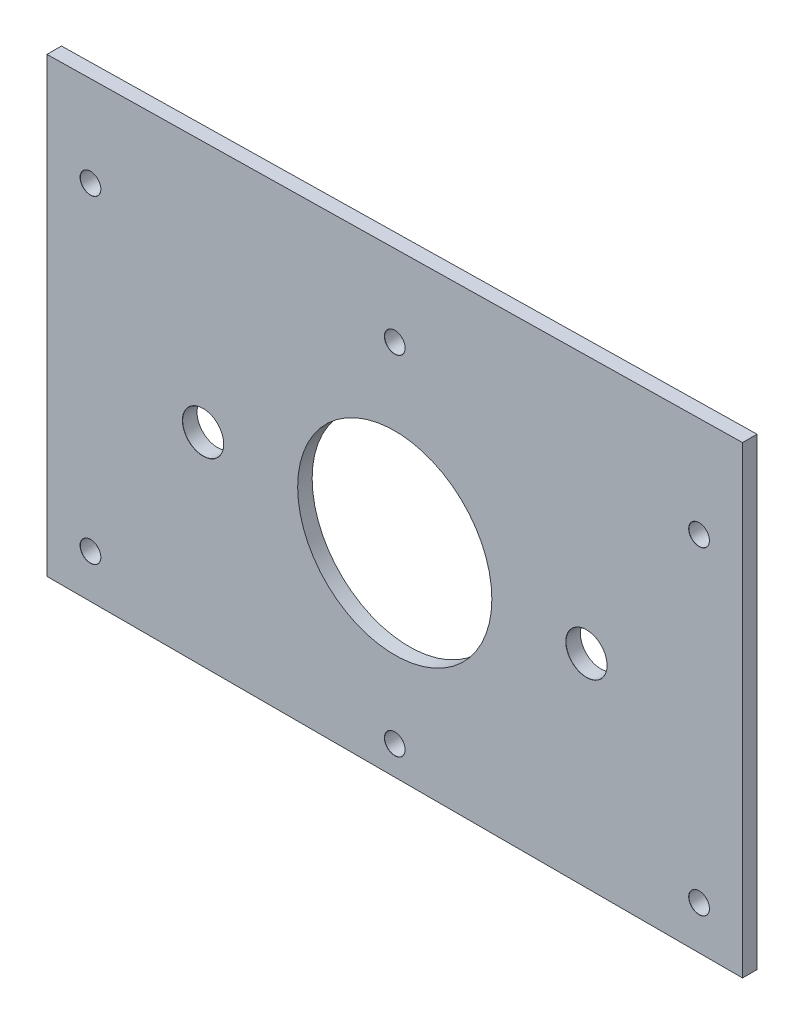
ISO-10303-21;
HEADER;
FILE_DESCRIPTION(('STEP AP214'),'2;1');
FILE_NAME('part.step','',(''),(''),'','','');
FILE_SCHEMA(('AUTOMOTIVE_DESIGN { 1 0 10303 214 1 1 1 1 }'));
ENDSEC;
DATA;
#1=APPLICATION_CONTEXT('core data for automotive mechanical design processes');
#2=APPLICATION_PROTOCOL_DEFINITION('international standard','automotive_design',2000,#1);
#3=PRODUCT_CONTEXT('',#1,'mechanical');
#4=PRODUCT('Part','Part','',(#3));
#5=PRODUCT_RELATED_PRODUCT_CATEGORY('part','',(#4));
#6=PRODUCT_DEFINITION_FORMATION('','',#4);
#7=PRODUCT_DEFINITION_CONTEXT('part definition',#1,'design');
#8=PRODUCT_DEFINITION('design','',#6,#7);
#9=PRODUCT_DEFINITION_SHAPE('','',#8);
#10=(LENGTH_UNIT() NAMED_UNIT(*) SI_UNIT(.MILLI.,.METRE.));
#11=(NAMED_UNIT(*) PLANE_ANGLE_UNIT() SI_UNIT($,.RADIAN.));
#12=(NAMED_UNIT(*) SI_UNIT($,.STERADIAN.) SOLID_ANGLE_UNIT());
#13=UNCERTAINTY_MEASURE_WITH_UNIT(LENGTH_MEASURE(1.E-05),#10,'distance_accuracy_value','');
#14=(GEOMETRIC_REPRESENTATION_CONTEXT(3) GLOBAL_UNCERTAINTY_ASSIGNED_CONTEXT((#13)) GLOBAL_UNIT_ASSIGNED_CONTEXT((#10,
#11,#12)) REPRESENTATION_CONTEXT('',''));
#15=CARTESIAN_POINT('',(0.,0.,0.));
#16=DIRECTION('',(0.,0.,1.));
#17=DIRECTION('',(1.,0.,0.));
#18=AXIS2_PLACEMENT_3D('',#15,#16,#17);
#19=CARTESIAN_POINT('',(76.2,44.45,3.175));
#20=DIRECTION('',(-1.,0.,0.));
#21=DIRECTION('',(0.,0.,1.));
#22=AXIS2_PLACEMENT_3D('',#19,#20,#21);
#23=PLANE('',#22);
#24=DIRECTION('',(0.,1.,0.));
#25=VECTOR('',#24,1.);
#26=CARTESIAN_POINT('',(76.2,44.45,0.));
#27=LINE('',#26,#25);
#28=CARTESIAN_POINT('',(76.2,-44.45,0.));
#29=VERTEX_POINT('',#28);
#30=CARTESIAN_POINT('',(76.2,57.15,0.));
#31=VERTEX_POINT('',#30);
#32=EDGE_CURVE('E74',#29,#31,#27,.T.);
#33=ORIENTED_EDGE('',*,*,#32,.T.);
#34=DIRECTION('',(0.,0.,-1.));
#35=VECTOR('',#34,1.);
#36=CARTESIAN_POINT('',(76.2,57.15,3.175));
#37=LINE('',#36,#35);
#38=CARTESIAN_POINT('',(76.2,57.15,3.175));
#39=VERTEX_POINT('',#38);
#40=EDGE_CURVE('E11',#39,#31,#37,.T.);
#41=ORIENTED_EDGE('',*,*,#40,.F.);
#42=DIRECTION('',(0.,1.,0.));
#43=VECTOR('',#42,1.);
#44=CARTESIAN_POINT('',(76.2,44.45,3.175));
#45=LINE('',#44,#43);
#46=CARTESIAN_POINT('',(76.2,-44.45,3.175));
#47=VERTEX_POINT('',#46);
#48=EDGE_CURVE('E79',#47,#39,#45,.T.);
#49=ORIENTED_EDGE('',*,*,#48,.F.);
#50=DIRECTION('',(0.,0.,-1.));
#51=VECTOR('',#50,1.);
#52=CARTESIAN_POINT('',(76.2,-44.45,3.175));
#53=LINE('',#52,#51);
#54=EDGE_CURVE('E95',#47,#29,#53,.T.);
#55=ORIENTED_EDGE('',*,*,#54,.T.);
#56=EDGE_LOOP('',(#33,#41,#49,#55));
#57=FACE_BOUND('',#56,.T.);
#58=ADVANCED_FACE('F35',(#57),#23,.F.);
#59=CARTESIAN_POINT('',(-76.2,54.61,3.175));
#60=DIRECTION('',(0.0166643523339933,-0.9998611400396,0.));
#61=DIRECTION('',(0.9998611400396,0.0166643523339933,0.));
#62=AXIS2_PLACEMENT_3D('',#59,#60,#61);
#63=PLANE('',#62);
#64=DIRECTION('',(-0.9998611400396,-0.0166643523339933,0.));
#65=VECTOR('',#64,1.);
#66=CARTESIAN_POINT('',(-76.2,54.61,0.));
#67=LINE('',#66,#65);
#68=CARTESIAN_POINT('',(-76.2,54.61,0.));
#69=VERTEX_POINT('',#68);
#70=EDGE_CURVE('E91',#31,#69,#67,.T.);
#71=ORIENTED_EDGE('',*,*,#70,.T.);
#72=DIRECTION('',(0.,0.,-1.));
#73=VECTOR('',#72,1.);
#74=CARTESIAN_POINT('',(-76.2,54.61,3.175));
#75=LINE('',#74,#73);
#76=CARTESIAN_POINT('',(-76.2,54.61,3.175));
#77=VERTEX_POINT('',#76);
#78=EDGE_CURVE('E43',#77,#69,#75,.T.);
#79=ORIENTED_EDGE('',*,*,#78,.F.);
#80=DIRECTION('',(-0.9998611400396,-0.0166643523339933,0.));
#81=VECTOR('',#80,1.);
#82=CARTESIAN_POINT('',(-76.2,54.61,3.175));
#83=LINE('',#82,#81);
#84=EDGE_CURVE('E82',#39,#77,#83,.T.);
#85=ORIENTED_EDGE('',*,*,#84,.F.);
#86=ORIENTED_EDGE('',*,*,#40,.T.);
#87=EDGE_LOOP('',(#71,#79,#85,#86));
#88=FACE_BOUND('',#87,.T.);
#89=ADVANCED_FACE('F90',(#88),#63,.F.);
#90=CARTESIAN_POINT('',(-76.2,44.45,3.175));
#91=DIRECTION('',(1.,0.,0.));
#92=DIRECTION('',(0.,0.,-1.));
#93=AXIS2_PLACEMENT_3D('',#90,#91,#92);
#94=PLANE('',#93);
#95=DIRECTION('',(0.,-1.,0.));
#96=VECTOR('',#95,1.);
#97=CARTESIAN_POINT('',(-76.2,44.45,0.));
#98=LINE('',#97,#96);
#99=CARTESIAN_POINT('',(-76.2,-44.45,0.));
#100=VERTEX_POINT('',#99);
#101=EDGE_CURVE('E67',#69,#100,#98,.T.);
#102=ORIENTED_EDGE('',*,*,#101,.T.);
#103=DIRECTION('',(0.,0.,-1.));
#104=VECTOR('',#103,1.);
#105=CARTESIAN_POINT('',(-76.2,-44.45,3.175));
#106=LINE('',#105,#104);
#107=CARTESIAN_POINT('',(-76.2,-44.45,3.175));
#108=VERTEX_POINT('',#107);
#109=EDGE_CURVE('E92',#108,#100,#106,.T.);
#110=ORIENTED_EDGE('',*,*,#109,.F.);
#111=DIRECTION('',(0.,-1.,0.));
#112=VECTOR('',#111,1.);
#113=CARTESIAN_POINT('',(-76.2,54.61,3.175));
#114=LINE('',#113,#112);
#115=EDGE_CURVE('E86',#77,#108,#114,.T.);
#116=ORIENTED_EDGE('',*,*,#115,.F.);
#117=ORIENTED_EDGE('',*,*,#78,.T.);
#118=EDGE_LOOP('',(#102,#110,#116,#117));
#119=FACE_BOUND('',#118,.T.);
#120=ADVANCED_FACE('F93',(#119),#94,.F.);
#121=CARTESIAN_POINT('',(-76.2,-44.45,3.175));
#122=DIRECTION('',(0.,1.,0.));
#123=DIRECTION('',(0.,0.,1.));
#124=AXIS2_PLACEMENT_3D('',#121,#122,#123);
#125=PLANE('',#124);
#126=DIRECTION('',(1.,0.,0.));
#127=VECTOR('',#126,1.);
#128=CARTESIAN_POINT('',(-76.2,-44.45,0.));
#129=LINE('',#128,#127);
#130=EDGE_CURVE('E103',#100,#29,#129,.T.);
#131=ORIENTED_EDGE('',*,*,#130,.T.);
#132=ORIENTED_EDGE('',*,*,#54,.F.);
#133=DIRECTION('',(1.,0.,0.));
#134=VECTOR('',#133,1.);
#135=CARTESIAN_POINT('',(-76.2,-44.45,3.175));
#136=LINE('',#135,#134);
#137=EDGE_CURVE('E51',#108,#47,#136,.T.);
#138=ORIENTED_EDGE('',*,*,#137,.F.);
#139=ORIENTED_EDGE('',*,*,#109,.T.);
#140=EDGE_LOOP('',(#131,#132,#138,#139));
#141=FACE_BOUND('',#140,.T.);
#142=ADVANCED_FACE('F108',(#141),#125,.F.);
#143=CARTESIAN_POINT('',(0.,0.,3.175));
#144=DIRECTION('',(0.,0.,1.));
#145=DIRECTION('',(1.,0.,0.));
#146=AXIS2_PLACEMENT_3D('',#143,#144,#145);
#147=PLANE('',#146);
#148=CARTESIAN_POINT('',(0.,0.,3.175));
#149=DIRECTION('',(0.,0.,1.));
#150=DIRECTION('',(1.,0.,0.));
#151=AXIS2_PLACEMENT_3D('',#148,#149,#150);
#152=CIRCLE('',#151,21.275);
#153=CARTESIAN_POINT('',(21.275,0.,3.175));
#154=VERTEX_POINT('',#153);
#155=EDGE_CURVE('E204',#154,#154,#152,.T.);
#156=ORIENTED_EDGE('',*,*,#155,.F.);
#157=EDGE_LOOP('',(#156));
#158=FACE_BOUND('',#157,.T.);
#159=CARTESIAN_POINT('',(-42.,0.,3.175));
#160=DIRECTION('',(0.,0.,1.));
#161=DIRECTION('',(1.,0.,0.));
#162=AXIS2_PLACEMENT_3D('',#159,#160,#161);
#163=CIRCLE('',#162,4.525);
#164=CARTESIAN_POINT('',(-37.475,0.,3.175));
#165=VERTEX_POINT('',#164);
#166=EDGE_CURVE('E200',#165,#165,#163,.T.);
#167=ORIENTED_EDGE('',*,*,#166,.F.);
#168=EDGE_LOOP('',(#167));
#169=FACE_BOUND('',#168,.T.);
#170=CARTESIAN_POINT('',(42.,0.,3.175));
#171=DIRECTION('',(0.,0.,1.));
#172=DIRECTION('',(1.,0.,0.));
#173=AXIS2_PLACEMENT_3D('',#170,#171,#172);
#174=CIRCLE('',#173,4.525);
#175=CARTESIAN_POINT('',(46.525,0.,3.175));
#176=VERTEX_POINT('',#175);
#177=EDGE_CURVE('E191',#176,#176,#174,.T.);
#178=ORIENTED_EDGE('',*,*,#177,.F.);
#179=EDGE_LOOP('',(#178));
#180=FACE_BOUND('',#179,.T.);
#181=CARTESIAN_POINT('',(-66.675,34.925,3.175));
#182=DIRECTION('',(0.,0.,1.));
#183=DIRECTION('',(1.,0.,0.));
#184=AXIS2_PLACEMENT_3D('',#181,#182,#183);
#185=CIRCLE('',#184,2.275);
#186=CARTESIAN_POINT('',(-64.4,34.925,3.175));
#187=VERTEX_POINT('',#186);
#188=EDGE_CURVE('E182',#187,#187,#185,.T.);
#189=ORIENTED_EDGE('',*,*,#188,.F.);
#190=EDGE_LOOP('',(#189));
#191=FACE_BOUND('',#190,.T.);
#192=CARTESIAN_POINT('',(-66.675,-34.925,3.175));
#193=DIRECTION('',(0.,0.,1.));
#194=DIRECTION('',(1.,0.,0.));
#195=AXIS2_PLACEMENT_3D('',#192,#193,#194);
#196=CIRCLE('',#195,2.275);
#197=CARTESIAN_POINT('',(-64.4,-34.925,3.175));
#198=VERTEX_POINT('',#197);
#199=EDGE_CURVE('E173',#198,#198,#196,.T.);
#200=ORIENTED_EDGE('',*,*,#199,.F.);
#201=EDGE_LOOP('',(#200));
#202=FACE_BOUND('',#201,.T.);
#203=CARTESIAN_POINT('',(0.,-38.1,3.175));
#204=DIRECTION('',(0.,0.,1.));
#205=DIRECTION('',(1.,0.,0.));
#206=AXIS2_PLACEMENT_3D('',#203,#204,#205);
#207=CIRCLE('',#206,2.275);
#208=CARTESIAN_POINT('',(2.27500000000003,-38.1,3.175));
#209=VERTEX_POINT('',#208);
#210=EDGE_CURVE('E164',#209,#209,#207,.T.);
#211=ORIENTED_EDGE('',*,*,#210,.F.);
#212=EDGE_LOOP('',(#211));
#213=FACE_BOUND('',#212,.T.);
#214=CARTESIAN_POINT('',(66.675,-34.925,3.175));
#215=DIRECTION('',(0.,0.,1.));
#216=DIRECTION('',(1.,0.,0.));
#217=AXIS2_PLACEMENT_3D('',#214,#215,#216);
#218=CIRCLE('',#217,2.275);
#219=CARTESIAN_POINT('',(68.95,-34.925,3.175));
#220=VERTEX_POINT('',#219);
#221=EDGE_CURVE('E155',#220,#220,#218,.T.);
#222=ORIENTED_EDGE('',*,*,#221,.F.);
#223=EDGE_LOOP('',(#222));
#224=FACE_BOUND('',#223,.T.);
#225=CARTESIAN_POINT('',(66.675,34.925,3.175));
#226=DIRECTION('',(0.,0.,1.));
#227=DIRECTION('',(1.,0.,0.));
#228=AXIS2_PLACEMENT_3D('',#225,#226,#227);
#229=CIRCLE('',#228,2.275);
#230=CARTESIAN_POINT('',(68.95,34.925,3.175));
#231=VERTEX_POINT('',#230);
#232=EDGE_CURVE('E146',#231,#231,#229,.T.);
#233=ORIENTED_EDGE('',*,*,#232,.F.);
#234=EDGE_LOOP('',(#233));
#235=FACE_BOUND('',#234,.T.);
#236=CARTESIAN_POINT('',(0.,38.1,3.175));
#237=DIRECTION('',(0.,0.,1.));
#238=DIRECTION('',(1.,0.,0.));
#239=AXIS2_PLACEMENT_3D('',#236,#237,#238);
#240=CIRCLE('',#239,2.275);
#241=CARTESIAN_POINT('',(2.27500000000003,38.1,3.175));
#242=VERTEX_POINT('',#241);
#243=EDGE_CURVE('E137',#242,#242,#240,.T.);
#244=ORIENTED_EDGE('',*,*,#243,.F.);
#245=EDGE_LOOP('',(#244));
#246=FACE_BOUND('',#245,.T.);
#247=ORIENTED_EDGE('',*,*,#48,.T.);
#248=ORIENTED_EDGE('',*,*,#84,.T.);
#249=ORIENTED_EDGE('',*,*,#115,.T.);
#250=ORIENTED_EDGE('',*,*,#137,.T.);
#251=EDGE_LOOP('',(#247,#248,#249,#250));
#252=FACE_BOUND('',#251,.T.);
#253=ADVANCED_FACE('F84',(#158,#169,#180,#191,#202,#213,#224,#235,#246,#252),#147,.T.);
#254=CARTESIAN_POINT('',(0.,0.,0.));
#255=DIRECTION('',(0.,0.,1.));
#256=DIRECTION('',(1.,0.,0.));
#257=AXIS2_PLACEMENT_3D('',#254,#255,#256);
#258=PLANE('',#257);
#259=CARTESIAN_POINT('',(0.,0.,0.));
#260=DIRECTION('',(0.,0.,1.));
#261=DIRECTION('',(1.,0.,0.));
#262=AXIS2_PLACEMENT_3D('',#259,#260,#261);
#263=CIRCLE('',#262,21.275);
#264=CARTESIAN_POINT('',(21.275,0.,0.));
#265=VERTEX_POINT('',#264);
#266=EDGE_CURVE('E203',#265,#265,#263,.T.);
#267=ORIENTED_EDGE('',*,*,#266,.T.);
#268=EDGE_LOOP('',(#267));
#269=FACE_BOUND('',#268,.T.);
#270=CARTESIAN_POINT('',(-42.,0.,0.));
#271=DIRECTION('',(0.,0.,1.));
#272=DIRECTION('',(1.,0.,0.));
#273=AXIS2_PLACEMENT_3D('',#270,#271,#272);
#274=CIRCLE('',#273,4.5);
#275=CARTESIAN_POINT('',(-37.5,0.,0.));
#276=VERTEX_POINT('',#275);
#277=EDGE_CURVE('E194',#276,#276,#274,.T.);
#278=ORIENTED_EDGE('',*,*,#277,.T.);
#279=EDGE_LOOP('',(#278));
#280=FACE_BOUND('',#279,.T.);
#281=CARTESIAN_POINT('',(42.,0.,0.));
#282=DIRECTION('',(0.,0.,1.));
#283=DIRECTION('',(1.,0.,0.));
#284=AXIS2_PLACEMENT_3D('',#281,#282,#283);
#285=CIRCLE('',#284,4.5);
#286=CARTESIAN_POINT('',(46.5,0.,0.));
#287=VERTEX_POINT('',#286);
#288=EDGE_CURVE('E185',#287,#287,#285,.T.);
#289=ORIENTED_EDGE('',*,*,#288,.T.);
#290=EDGE_LOOP('',(#289));
#291=FACE_BOUND('',#290,.T.);
#292=CARTESIAN_POINT('',(-66.675,34.925,0.));
#293=DIRECTION('',(0.,0.,1.));
#294=DIRECTION('',(1.,0.,0.));
#295=AXIS2_PLACEMENT_3D('',#292,#293,#294);
#296=CIRCLE('',#295,2.25);
#297=CARTESIAN_POINT('',(-64.425,34.925,0.));
#298=VERTEX_POINT('',#297);
#299=EDGE_CURVE('E176',#298,#298,#296,.T.);
#300=ORIENTED_EDGE('',*,*,#299,.T.);
#301=EDGE_LOOP('',(#300));
#302=FACE_BOUND('',#301,.T.);
#303=CARTESIAN_POINT('',(-66.675,-34.925,0.));
#304=DIRECTION('',(0.,0.,1.));
#305=DIRECTION('',(1.,0.,0.));
#306=AXIS2_PLACEMENT_3D('',#303,#304,#305);
#307=CIRCLE('',#306,2.25);
#308=CARTESIAN_POINT('',(-64.425,-34.925,0.));
#309=VERTEX_POINT('',#308);
#310=EDGE_CURVE('E167',#309,#309,#307,.T.);
#311=ORIENTED_EDGE('',*,*,#310,.T.);
#312=EDGE_LOOP('',(#311));
#313=FACE_BOUND('',#312,.T.);
#314=CARTESIAN_POINT('',(0.,-38.1,0.));
#315=DIRECTION('',(0.,0.,1.));
#316=DIRECTION('',(1.,0.,0.));
#317=AXIS2_PLACEMENT_3D('',#314,#315,#316);
#318=CIRCLE('',#317,2.25);
#319=CARTESIAN_POINT('',(2.25000000000003,-38.1,0.));
#320=VERTEX_POINT('',#319);
#321=EDGE_CURVE('E158',#320,#320,#318,.T.);
#322=ORIENTED_EDGE('',*,*,#321,.T.);
#323=EDGE_LOOP('',(#322));
#324=FACE_BOUND('',#323,.T.);
#325=CARTESIAN_POINT('',(66.675,-34.925,0.));
#326=DIRECTION('',(0.,0.,1.));
#327=DIRECTION('',(1.,0.,0.));
#328=AXIS2_PLACEMENT_3D('',#325,#326,#327);
#329=CIRCLE('',#328,2.25);
#330=CARTESIAN_POINT('',(68.925,-34.925,0.));
#331=VERTEX_POINT('',#330);
#332=EDGE_CURVE('E149',#331,#331,#329,.T.);
#333=ORIENTED_EDGE('',*,*,#332,.T.);
#334=EDGE_LOOP('',(#333));
#335=FACE_BOUND('',#334,.T.);
#336=CARTESIAN_POINT('',(66.675,34.925,0.));
#337=DIRECTION('',(0.,0.,1.));
#338=DIRECTION('',(1.,0.,0.));
#339=AXIS2_PLACEMENT_3D('',#336,#337,#338);
#340=CIRCLE('',#339,2.25);
#341=CARTESIAN_POINT('',(68.925,34.925,0.));
#342=VERTEX_POINT('',#341);
#343=EDGE_CURVE('E140',#342,#342,#340,.T.);
#344=ORIENTED_EDGE('',*,*,#343,.T.);
#345=EDGE_LOOP('',(#344));
#346=FACE_BOUND('',#345,.T.);
#347=CARTESIAN_POINT('',(0.,38.1,0.));
#348=DIRECTION('',(0.,0.,1.));
#349=DIRECTION('',(1.,0.,0.));
#350=AXIS2_PLACEMENT_3D('',#347,#348,#349);
#351=CIRCLE('',#350,2.25);
#352=CARTESIAN_POINT('',(2.25000000000003,38.1,0.));
#353=VERTEX_POINT('',#352);
#354=EDGE_CURVE('E100',#353,#353,#351,.T.);
#355=ORIENTED_EDGE('',*,*,#354,.T.);
#356=EDGE_LOOP('',(#355));
#357=FACE_BOUND('',#356,.T.);
#358=ORIENTED_EDGE('',*,*,#32,.F.);
#359=ORIENTED_EDGE('',*,*,#130,.F.);
#360=ORIENTED_EDGE('',*,*,#101,.F.);
#361=ORIENTED_EDGE('',*,*,#70,.F.);
#362=EDGE_LOOP('',(#358,#359,#360,#361));
#363=FACE_BOUND('',#362,.T.);
#364=ADVANCED_FACE('F109',(#269,#280,#291,#302,#313,#324,#335,#346,#357,#363),#258,.F.);
#365=CARTESIAN_POINT('',(0.,38.1,3.175));
#366=DIRECTION('',(0.,0.,1.));
#367=DIRECTION('',(1.,0.,0.));
#368=AXIS2_PLACEMENT_3D('',#365,#366,#367);
#369=CYLINDRICAL_SURFACE('',#368,2.25);
#370=ORIENTED_EDGE('',*,*,#354,.F.);
#371=EDGE_LOOP('',(#370));
#372=FACE_BOUND('',#371,.T.);
#373=CARTESIAN_POINT('',(0.,38.1,3.15));
#374=DIRECTION('',(0.,0.,1.));
#375=DIRECTION('',(1.,0.,0.));
#376=AXIS2_PLACEMENT_3D('',#373,#374,#375);
#377=CIRCLE('',#376,2.25);
#378=CARTESIAN_POINT('',(2.25000000000003,38.1,3.15));
#379=VERTEX_POINT('',#378);
#380=EDGE_CURVE('E134',#379,#379,#377,.T.);
#381=ORIENTED_EDGE('',*,*,#380,.T.);
#382=EDGE_LOOP('',(#381));
#383=FACE_BOUND('',#382,.T.);
#384=ADVANCED_FACE('F111',(#372,#383),#369,.F.);
#385=CARTESIAN_POINT('',(0.,38.1,3.175));
#386=DIRECTION('',(0.,0.,1.));
#387=DIRECTION('',(1.,0.,0.));
#388=AXIS2_PLACEMENT_3D('',#385,#386,#387);
#389=CONICAL_SURFACE('',#388,2.275,0.785398163397396);
#390=ORIENTED_EDGE('',*,*,#380,.F.);
#391=EDGE_LOOP('',(#390));
#392=FACE_BOUND('',#391,.T.);
#393=ORIENTED_EDGE('',*,*,#243,.T.);
#394=EDGE_LOOP('',(#393));
#395=FACE_BOUND('',#394,.T.);
#396=ADVANCED_FACE('F118',(#392,#395),#389,.F.);
#397=CARTESIAN_POINT('',(66.675,34.925,3.175));
#398=DIRECTION('',(0.,0.,1.));
#399=DIRECTION('',(1.,0.,0.));
#400=AXIS2_PLACEMENT_3D('',#397,#398,#399);
#401=CYLINDRICAL_SURFACE('',#400,2.25);
#402=ORIENTED_EDGE('',*,*,#343,.F.);
#403=EDGE_LOOP('',(#402));
#404=FACE_BOUND('',#403,.T.);
#405=CARTESIAN_POINT('',(66.675,34.925,3.15));
#406=DIRECTION('',(0.,0.,1.));
#407=DIRECTION('',(1.,0.,0.));
#408=AXIS2_PLACEMENT_3D('',#405,#406,#407);
#409=CIRCLE('',#408,2.25);
#410=CARTESIAN_POINT('',(68.925,34.925,3.15));
#411=VERTEX_POINT('',#410);
#412=EDGE_CURVE('E143',#411,#411,#409,.T.);
#413=ORIENTED_EDGE('',*,*,#412,.T.);
#414=EDGE_LOOP('',(#413));
#415=FACE_BOUND('',#414,.T.);
#416=ADVANCED_FACE('F233',(#404,#415),#401,.F.);
#417=CARTESIAN_POINT('',(66.675,34.925,3.175));
#418=DIRECTION('',(0.,0.,1.));
#419=DIRECTION('',(1.,0.,0.));
#420=AXIS2_PLACEMENT_3D('',#417,#418,#419);
#421=CONICAL_SURFACE('',#420,2.275,0.785398163397353);
#422=ORIENTED_EDGE('',*,*,#412,.F.);
#423=EDGE_LOOP('',(#422));
#424=FACE_BOUND('',#423,.T.);
#425=ORIENTED_EDGE('',*,*,#232,.T.);
#426=EDGE_LOOP('',(#425));
#427=FACE_BOUND('',#426,.T.);
#428=ADVANCED_FACE('F239',(#424,#427),#421,.F.);
#429=CARTESIAN_POINT('',(66.675,-34.925,3.175));
#430=DIRECTION('',(0.,0.,1.));
#431=DIRECTION('',(1.,0.,0.));
#432=AXIS2_PLACEMENT_3D('',#429,#430,#431);
#433=CYLINDRICAL_SURFACE('',#432,2.25);
#434=ORIENTED_EDGE('',*,*,#332,.F.);
#435=EDGE_LOOP('',(#434));
#436=FACE_BOUND('',#435,.T.);
#437=CARTESIAN_POINT('',(66.675,-34.925,3.15));
#438=DIRECTION('',(0.,0.,1.));
#439=DIRECTION('',(1.,0.,0.));
#440=AXIS2_PLACEMENT_3D('',#437,#438,#439);
#441=CIRCLE('',#440,2.25);
#442=CARTESIAN_POINT('',(68.925,-34.925,3.15));
#443=VERTEX_POINT('',#442);
#444=EDGE_CURVE('E152',#443,#443,#441,.T.);
#445=ORIENTED_EDGE('',*,*,#444,.T.);
#446=EDGE_LOOP('',(#445));
#447=FACE_BOUND('',#446,.T.);
#448=ADVANCED_FACE('F246',(#436,#447),#433,.F.);
#449=CARTESIAN_POINT('',(66.675,-34.925,3.175));
#450=DIRECTION('',(0.,0.,1.));
#451=DIRECTION('',(1.,0.,0.));
#452=AXIS2_PLACEMENT_3D('',#449,#450,#451);
#453=CONICAL_SURFACE('',#452,2.275,0.785398163397353);
#454=ORIENTED_EDGE('',*,*,#444,.F.);
#455=EDGE_LOOP('',(#454));
#456=FACE_BOUND('',#455,.T.);
#457=ORIENTED_EDGE('',*,*,#221,.T.);
#458=EDGE_LOOP('',(#457));
#459=FACE_BOUND('',#458,.T.);
#460=ADVANCED_FACE('F250',(#456,#459),#453,.F.);
#461=CARTESIAN_POINT('',(0.,-38.1,3.175));
#462=DIRECTION('',(0.,0.,1.));
#463=DIRECTION('',(1.,0.,0.));
#464=AXIS2_PLACEMENT_3D('',#461,#462,#463);
#465=CYLINDRICAL_SURFACE('',#464,2.25);
#466=ORIENTED_EDGE('',*,*,#321,.F.);
#467=EDGE_LOOP('',(#466));
#468=FACE_BOUND('',#467,.T.);
#469=CARTESIAN_POINT('',(0.,-38.1,3.15));
#470=DIRECTION('',(0.,0.,1.));
#471=DIRECTION('',(1.,0.,0.));
#472=AXIS2_PLACEMENT_3D('',#469,#470,#471);
#473=CIRCLE('',#472,2.25);
#474=CARTESIAN_POINT('',(2.25000000000003,-38.1,3.15));
#475=VERTEX_POINT('',#474);
#476=EDGE_CURVE('E161',#475,#475,#473,.T.);
#477=ORIENTED_EDGE('',*,*,#476,.T.);
#478=EDGE_LOOP('',(#477));
#479=FACE_BOUND('',#478,.T.);
#480=ADVANCED_FACE('F254',(#468,#479),#465,.F.);
#481=CARTESIAN_POINT('',(0.,-38.1,3.175));
#482=DIRECTION('',(0.,0.,1.));
#483=DIRECTION('',(1.,0.,0.));
#484=AXIS2_PLACEMENT_3D('',#481,#482,#483);
#485=CONICAL_SURFACE('',#484,2.275,0.785398163397396);
#486=ORIENTED_EDGE('',*,*,#476,.F.);
#487=EDGE_LOOP('',(#486));
#488=FACE_BOUND('',#487,.T.);
#489=ORIENTED_EDGE('',*,*,#210,.T.);
#490=EDGE_LOOP('',(#489));
#491=FACE_BOUND('',#490,.T.);
#492=ADVANCED_FACE('F258',(#488,#491),#485,.F.);
#493=CARTESIAN_POINT('',(-66.675,-34.925,3.175));
#494=DIRECTION('',(0.,0.,1.));
#495=DIRECTION('',(1.,0.,0.));
#496=AXIS2_PLACEMENT_3D('',#493,#494,#495);
#497=CYLINDRICAL_SURFACE('',#496,2.25);
#498=ORIENTED_EDGE('',*,*,#310,.F.);
#499=EDGE_LOOP('',(#498));
#500=FACE_BOUND('',#499,.T.);
#501=CARTESIAN_POINT('',(-66.675,-34.925,3.15));
#502=DIRECTION('',(0.,0.,1.));
#503=DIRECTION('',(1.,0.,0.));
#504=AXIS2_PLACEMENT_3D('',#501,#502,#503);
#505=CIRCLE('',#504,2.25);
#506=CARTESIAN_POINT('',(-64.425,-34.925,3.15));
#507=VERTEX_POINT('',#506);
#508=EDGE_CURVE('E170',#507,#507,#505,.T.);
#509=ORIENTED_EDGE('',*,*,#508,.T.);
#510=EDGE_LOOP('',(#509));
#511=FACE_BOUND('',#510,.T.);
#512=ADVANCED_FACE('F262',(#500,#511),#497,.F.);
#513=CARTESIAN_POINT('',(-66.675,-34.925,3.175));
#514=DIRECTION('',(0.,0.,1.));
#515=DIRECTION('',(1.,0.,0.));
#516=AXIS2_PLACEMENT_3D('',#513,#514,#515);
#517=CONICAL_SURFACE('',#516,2.275,0.785398163397353);
#518=ORIENTED_EDGE('',*,*,#508,.F.);
#519=EDGE_LOOP('',(#518));
#520=FACE_BOUND('',#519,.T.);
#521=ORIENTED_EDGE('',*,*,#199,.T.);
#522=EDGE_LOOP('',(#521));
#523=FACE_BOUND('',#522,.T.);
#524=ADVANCED_FACE('F266',(#520,#523),#517,.F.);
#525=CARTESIAN_POINT('',(-66.675,34.925,3.175));
#526=DIRECTION('',(0.,0.,1.));
#527=DIRECTION('',(1.,0.,0.));
#528=AXIS2_PLACEMENT_3D('',#525,#526,#527);
#529=CYLINDRICAL_SURFACE('',#528,2.25);
#530=ORIENTED_EDGE('',*,*,#299,.F.);
#531=EDGE_LOOP('',(#530));
#532=FACE_BOUND('',#531,.T.);
#533=CARTESIAN_POINT('',(-66.675,34.925,3.15));
#534=DIRECTION('',(0.,0.,1.));
#535=DIRECTION('',(1.,0.,0.));
#536=AXIS2_PLACEMENT_3D('',#533,#534,#535);
#537=CIRCLE('',#536,2.25);
#538=CARTESIAN_POINT('',(-64.425,34.925,3.15));
#539=VERTEX_POINT('',#538);
#540=EDGE_CURVE('E179',#539,#539,#537,.T.);
#541=ORIENTED_EDGE('',*,*,#540,.T.);
#542=EDGE_LOOP('',(#541));
#543=FACE_BOUND('',#542,.T.);
#544=ADVANCED_FACE('F270',(#532,#543),#529,.F.);
#545=CARTESIAN_POINT('',(-66.675,34.925,3.175));
#546=DIRECTION('',(0.,0.,1.));
#547=DIRECTION('',(1.,0.,0.));
#548=AXIS2_PLACEMENT_3D('',#545,#546,#547);
#549=CONICAL_SURFACE('',#548,2.275,0.785398163397353);
#550=ORIENTED_EDGE('',*,*,#540,.F.);
#551=EDGE_LOOP('',(#550));
#552=FACE_BOUND('',#551,.T.);
#553=ORIENTED_EDGE('',*,*,#188,.T.);
#554=EDGE_LOOP('',(#553));
#555=FACE_BOUND('',#554,.T.);
#556=ADVANCED_FACE('F274',(#552,#555),#549,.F.);
#557=CARTESIAN_POINT('',(42.,0.,3.175));
#558=DIRECTION('',(0.,0.,1.));
#559=DIRECTION('',(1.,0.,0.));
#560=AXIS2_PLACEMENT_3D('',#557,#558,#559);
#561=CYLINDRICAL_SURFACE('',#560,4.5);
#562=ORIENTED_EDGE('',*,*,#288,.F.);
#563=EDGE_LOOP('',(#562));
#564=FACE_BOUND('',#563,.T.);
#565=CARTESIAN_POINT('',(42.,0.,3.15));
#566=DIRECTION('',(0.,0.,1.));
#567=DIRECTION('',(1.,0.,0.));
#568=AXIS2_PLACEMENT_3D('',#565,#566,#567);
#569=CIRCLE('',#568,4.5);
#570=CARTESIAN_POINT('',(46.5,0.,3.15));
#571=VERTEX_POINT('',#570);
#572=EDGE_CURVE('E188',#571,#571,#569,.T.);
#573=ORIENTED_EDGE('',*,*,#572,.T.);
#574=EDGE_LOOP('',(#573));
#575=FACE_BOUND('',#574,.T.);
#576=ADVANCED_FACE('F278',(#564,#575),#561,.F.);
#577=CARTESIAN_POINT('',(42.,0.,3.175));
#578=DIRECTION('',(0.,0.,1.));
#579=DIRECTION('',(1.,0.,0.));
#580=AXIS2_PLACEMENT_3D('',#577,#578,#579);
#581=CONICAL_SURFACE('',#580,4.525,0.7853981633975);
#582=ORIENTED_EDGE('',*,*,#572,.F.);
#583=EDGE_LOOP('',(#582));
#584=FACE_BOUND('',#583,.T.);
#585=ORIENTED_EDGE('',*,*,#177,.T.);
#586=EDGE_LOOP('',(#585));
#587=FACE_BOUND('',#586,.T.);
#588=ADVANCED_FACE('F282',(#584,#587),#581,.F.);
#589=CARTESIAN_POINT('',(-42.,0.,3.175));
#590=DIRECTION('',(0.,0.,1.));
#591=DIRECTION('',(1.,0.,0.));
#592=AXIS2_PLACEMENT_3D('',#589,#590,#591);
#593=CYLINDRICAL_SURFACE('',#592,4.5);
#594=ORIENTED_EDGE('',*,*,#277,.F.);
#595=EDGE_LOOP('',(#594));
#596=FACE_BOUND('',#595,.T.);
#597=CARTESIAN_POINT('',(-42.,0.,3.15));
#598=DIRECTION('',(0.,0.,1.));
#599=DIRECTION('',(1.,0.,0.));
#600=AXIS2_PLACEMENT_3D('',#597,#598,#599);
#601=CIRCLE('',#600,4.5);
#602=CARTESIAN_POINT('',(-37.5,0.,3.15));
#603=VERTEX_POINT('',#602);
#604=EDGE_CURVE('E197',#603,#603,#601,.T.);
#605=ORIENTED_EDGE('',*,*,#604,.T.);
#606=EDGE_LOOP('',(#605));
#607=FACE_BOUND('',#606,.T.);
#608=ADVANCED_FACE('F286',(#596,#607),#593,.F.);
#609=CARTESIAN_POINT('',(-42.,0.,3.175));
#610=DIRECTION('',(0.,0.,1.));
#611=DIRECTION('',(1.,0.,0.));
#612=AXIS2_PLACEMENT_3D('',#609,#610,#611);
#613=CONICAL_SURFACE('',#612,4.525,0.7853981633975);
#614=ORIENTED_EDGE('',*,*,#604,.F.);
#615=EDGE_LOOP('',(#614));
#616=FACE_BOUND('',#615,.T.);
#617=ORIENTED_EDGE('',*,*,#166,.T.);
#618=EDGE_LOOP('',(#617));
#619=FACE_BOUND('',#618,.T.);
#620=ADVANCED_FACE('F212',(#616,#619),#613,.F.);
#621=CARTESIAN_POINT('',(0.,0.,0.));
#622=DIRECTION('',(0.,0.,1.));
#623=DIRECTION('',(1.,0.,0.));
#624=AXIS2_PLACEMENT_3D('',#621,#622,#623);
#625=CYLINDRICAL_SURFACE('',#624,21.275);
#626=ORIENTED_EDGE('',*,*,#266,.F.);
#627=EDGE_LOOP('',(#626));
#628=FACE_BOUND('',#627,.T.);
#629=ORIENTED_EDGE('',*,*,#155,.T.);
#630=EDGE_LOOP('',(#629));
#631=FACE_BOUND('',#630,.T.);
#632=ADVANCED_FACE('F209',(#628,#631),#625,.F.);
#633=CLOSED_SHELL('',(#58,#89,#120,#142,#253,#364,#384,#396,#416,#428,#448,#460,#480,#492,#512,
#524,#544,#556,#576,#588,#608,#620,#632));
#634=MANIFOLD_SOLID_BREP('B2',#633);
#635=ADVANCED_BREP_SHAPE_REPRESENTATION('',(#18,#634),#14);
#636=SHAPE_DEFINITION_REPRESENTATION(#9,#635);
ENDSEC;
END-ISO-10303-21;
